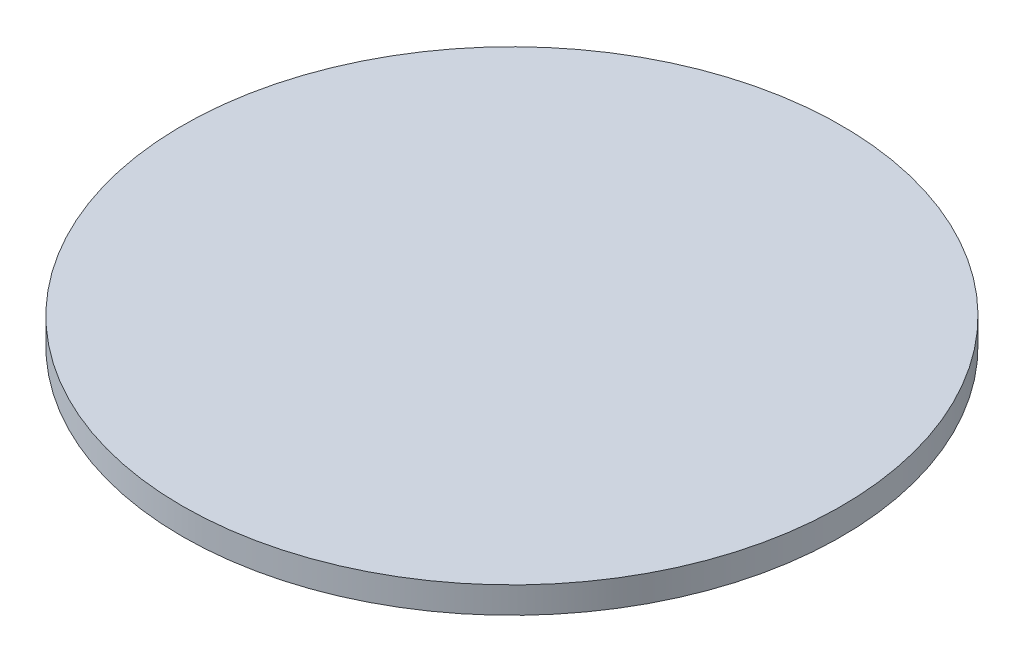
ISO-10303-21;
HEADER;
FILE_DESCRIPTION(('STEP AP214'),'2;1');
FILE_NAME('part.step','',(''),(''),'','','');
FILE_SCHEMA(('AUTOMOTIVE_DESIGN { 1 0 10303 214 1 1 1 1 }'));
ENDSEC;
DATA;
#1=APPLICATION_CONTEXT('core data for automotive mechanical design processes');
#2=APPLICATION_PROTOCOL_DEFINITION('international standard','automotive_design',2000,#1);
#3=PRODUCT_CONTEXT('',#1,'mechanical');
#4=PRODUCT('Part','Part','',(#3));
#5=PRODUCT_RELATED_PRODUCT_CATEGORY('part','',(#4));
#6=PRODUCT_DEFINITION_FORMATION('','',#4);
#7=PRODUCT_DEFINITION_CONTEXT('part definition',#1,'design');
#8=PRODUCT_DEFINITION('design','',#6,#7);
#9=PRODUCT_DEFINITION_SHAPE('','',#8);
#10=(LENGTH_UNIT() NAMED_UNIT(*) SI_UNIT(.MILLI.,.METRE.));
#11=(NAMED_UNIT(*) PLANE_ANGLE_UNIT() SI_UNIT($,.RADIAN.));
#12=(NAMED_UNIT(*) SI_UNIT($,.STERADIAN.) SOLID_ANGLE_UNIT());
#13=UNCERTAINTY_MEASURE_WITH_UNIT(LENGTH_MEASURE(1.E-05),#10,'distance_accuracy_value','');
#14=(GEOMETRIC_REPRESENTATION_CONTEXT(3) GLOBAL_UNCERTAINTY_ASSIGNED_CONTEXT((#13)) GLOBAL_UNIT_ASSIGNED_CONTEXT((#10,
#11,#12)) REPRESENTATION_CONTEXT('',''));
#15=CARTESIAN_POINT('',(0.,0.,0.));
#16=DIRECTION('',(0.,0.,1.));
#17=DIRECTION('',(1.,0.,0.));
#18=AXIS2_PLACEMENT_3D('',#15,#16,#17);
#19=CARTESIAN_POINT('',(0.,70.,0.));
#20=DIRECTION('',(0.,-1.,0.));
#21=DIRECTION('',(0.,0.,-1.));
#22=AXIS2_PLACEMENT_3D('',#19,#20,#21);
#23=CYLINDRICAL_SURFACE('',#22,25.);
#24=CARTESIAN_POINT('',(0.,45.,0.));
#25=DIRECTION('',(0.,1.,0.));
#26=DIRECTION('',(0.,0.,1.));
#27=AXIS2_PLACEMENT_3D('',#24,#25,#26);
#28=CIRCLE('',#27,25.);
#29=CARTESIAN_POINT('',(0.,45.,25.));
#30=VERTEX_POINT('',#29);
#31=EDGE_CURVE('E42',#30,#30,#28,.T.);
#32=ORIENTED_EDGE('',*,*,#31,.T.);
#33=EDGE_LOOP('',(#32));
#34=FACE_BOUND('',#33,.T.);
#35=CARTESIAN_POINT('',(0.,70.,0.));
#36=DIRECTION('',(0.,1.,0.));
#37=DIRECTION('',(0.,0.,1.));
#38=AXIS2_PLACEMENT_3D('',#35,#36,#37);
#39=CIRCLE('',#38,25.);
#40=CARTESIAN_POINT('',(0.,70.,25.));
#41=VERTEX_POINT('',#40);
#42=EDGE_CURVE('E49',#41,#41,#39,.T.);
#43=ORIENTED_EDGE('',*,*,#42,.F.);
#44=EDGE_LOOP('',(#43));
#45=FACE_BOUND('',#44,.T.);
#46=ADVANCED_FACE('F39',(#34,#45),#23,.T.);
#47=CARTESIAN_POINT('',(-74.5562616578539,45.,1.56287456729842));
#48=DIRECTION('',(0.,-1.,0.));
#49=DIRECTION('',(0.,0.,-1.));
#50=AXIS2_PLACEMENT_3D('',#47,#48,#49);
#51=CYLINDRICAL_SURFACE('',#50,25.);
#52=CARTESIAN_POINT('',(-74.5562616578539,40.,1.56287456729842));
#53=DIRECTION('',(0.,1.,0.));
#54=DIRECTION('',(0.,0.,1.));
#55=AXIS2_PLACEMENT_3D('',#52,#53,#54);
#56=CIRCLE('',#55,25.);
#57=CARTESIAN_POINT('',(-49.9259355921232,40.,-2.72046967473791));
#58=VERTEX_POINT('',#57);
#59=CARTESIAN_POINT('',(-49.7680731491791,40.,4.81029053363275));
#60=VERTEX_POINT('',#59);
#61=EDGE_CURVE('E76',#58,#60,#56,.T.);
#62=ORIENTED_EDGE('',*,*,#61,.T.);
#63=DIRECTION('',(0.,-1.,0.));
#64=VECTOR('',#63,1.);
#65=CARTESIAN_POINT('',(-49.7680731491791,45.,4.81029053363275));
#66=LINE('',#65,#64);
#67=CARTESIAN_POINT('',(-49.7680731491791,45.,4.81029053363275));
#68=VERTEX_POINT('',#67);
#69=EDGE_CURVE('E72',#68,#60,#66,.T.);
#70=ORIENTED_EDGE('',*,*,#69,.F.);
#71=CARTESIAN_POINT('',(-74.5562616578539,45.,1.56287456729842));
#72=DIRECTION('',(0.,1.,0.));
#73=DIRECTION('',(0.,0.,1.));
#74=AXIS2_PLACEMENT_3D('',#71,#72,#73);
#75=CIRCLE('',#74,25.);
#76=CARTESIAN_POINT('',(-49.9259355921232,45.,-2.72046967473791));
#77=VERTEX_POINT('',#76);
#78=EDGE_CURVE('E75',#77,#68,#75,.T.);
#79=ORIENTED_EDGE('',*,*,#78,.F.);
#80=DIRECTION('',(0.,-1.,0.));
#81=VECTOR('',#80,1.);
#82=CARTESIAN_POINT('',(-49.9259355921232,45.,-2.72046967473791));
#83=LINE('',#82,#81);
#84=EDGE_CURVE('E69',#77,#58,#83,.T.);
#85=ORIENTED_EDGE('',*,*,#84,.T.);
#86=EDGE_LOOP('',(#62,#70,#79,#85));
#87=FACE_BOUND('',#86,.T.);
#88=ADVANCED_FACE('F79',(#87),#51,.T.);
#89=CARTESIAN_POINT('',(0.,45.,0.));
#90=DIRECTION('',(0.,-1.,0.));
#91=DIRECTION('',(0.,0.,-1.));
#92=AXIS2_PLACEMENT_3D('',#89,#90,#91);
#93=CYLINDRICAL_SURFACE('',#92,50.);
#94=CARTESIAN_POINT('',(0.,40.,0.));
#95=DIRECTION('',(0.,1.,0.));
#96=DIRECTION('',(0.,0.,1.));
#97=AXIS2_PLACEMENT_3D('',#94,#95,#96);
#98=CIRCLE('',#97,50.);
#99=EDGE_CURVE('E64',#60,#58,#98,.T.);
#100=ORIENTED_EDGE('',*,*,#99,.T.);
#101=ORIENTED_EDGE('',*,*,#84,.F.);
#102=CARTESIAN_POINT('',(0.,45.,0.));
#103=DIRECTION('',(0.,1.,0.));
#104=DIRECTION('',(0.,0.,1.));
#105=AXIS2_PLACEMENT_3D('',#102,#103,#104);
#106=CIRCLE('',#105,50.);
#107=EDGE_CURVE('E56',#68,#77,#106,.T.);
#108=ORIENTED_EDGE('',*,*,#107,.F.);
#109=ORIENTED_EDGE('',*,*,#69,.T.);
#110=EDGE_LOOP('',(#100,#101,#108,#109));
#111=FACE_BOUND('',#110,.T.);
#112=ADVANCED_FACE('F68',(#111),#93,.T.);
#113=CARTESIAN_POINT('',(-37.2781308289269,45.,0.781437283649211));
#114=DIRECTION('',(0.,1.,0.));
#115=DIRECTION('',(0.,0.,1.));
#116=AXIS2_PLACEMENT_3D('',#113,#114,#115);
#117=PLANE('',#116);
#118=ORIENTED_EDGE('',*,*,#31,.F.);
#119=EDGE_LOOP('',(#118));
#120=FACE_BOUND('',#119,.T.);
#121=ORIENTED_EDGE('',*,*,#78,.T.);
#122=ORIENTED_EDGE('',*,*,#107,.T.);
#123=EDGE_LOOP('',(#121,#122));
#124=FACE_BOUND('',#123,.T.);
#125=ADVANCED_FACE('F109',(#120,#124),#117,.T.);
#126=CARTESIAN_POINT('',(-37.2781308289269,40.,0.781437283649211));
#127=DIRECTION('',(0.,1.,0.));
#128=DIRECTION('',(0.,0.,1.));
#129=AXIS2_PLACEMENT_3D('',#126,#127,#128);
#130=PLANE('',#129);
#131=CARTESIAN_POINT('',(0.,40.,0.));
#132=DIRECTION('',(0.,1.,0.));
#133=DIRECTION('',(0.,0.,1.));
#134=AXIS2_PLACEMENT_3D('',#131,#132,#133);
#135=CIRCLE('',#134,25.);
#136=CARTESIAN_POINT('',(0.,40.,25.));
#137=VERTEX_POINT('',#136);
#138=EDGE_CURVE('E11',#137,#137,#135,.T.);
#139=ORIENTED_EDGE('',*,*,#138,.T.);
#140=EDGE_LOOP('',(#139));
#141=FACE_BOUND('',#140,.T.);
#142=ORIENTED_EDGE('',*,*,#61,.F.);
#143=ORIENTED_EDGE('',*,*,#99,.F.);
#144=EDGE_LOOP('',(#142,#143));
#145=FACE_BOUND('',#144,.T.);
#146=ADVANCED_FACE('F82',(#141,#145),#130,.F.);
#147=CARTESIAN_POINT('',(0.,0.,0.));
#148=DIRECTION('',(0.,1.,0.));
#149=DIRECTION('',(0.,0.,1.));
#150=AXIS2_PLACEMENT_3D('',#147,#148,#149);
#151=PLANE('',#150);
#152=CARTESIAN_POINT('',(0.,0.,0.));
#153=DIRECTION('',(0.,1.,0.));
#154=DIRECTION('',(0.,0.,1.));
#155=AXIS2_PLACEMENT_3D('',#152,#153,#154);
#156=CIRCLE('',#155,25.);
#157=CARTESIAN_POINT('',(0.,0.,25.));
#158=VERTEX_POINT('',#157);
#159=EDGE_CURVE('E98',#158,#158,#156,.T.);
#160=ORIENTED_EDGE('',*,*,#159,.F.);
#161=EDGE_LOOP('',(#160));
#162=FACE_BOUND('',#161,.T.);
#163=ADVANCED_FACE('F139',(#162),#151,.F.);
#164=ORIENTED_EDGE('',*,*,#159,.T.);
#165=EDGE_LOOP('',(#164));
#166=FACE_BOUND('',#165,.T.);
#167=ORIENTED_EDGE('',*,*,#138,.F.);
#168=EDGE_LOOP('',(#167));
#169=FACE_BOUND('',#168,.T.);
#170=ADVANCED_FACE('F133',(#166,#169),#23,.T.);
#171=CARTESIAN_POINT('',(0.,80.,0.));
#172=DIRECTION('',(0.,-1.,0.));
#173=DIRECTION('',(0.,0.,-1.));
#174=AXIS2_PLACEMENT_3D('',#171,#172,#173);
#175=CYLINDRICAL_SURFACE('',#174,125.);
#176=CARTESIAN_POINT('',(0.,80.,0.));
#177=DIRECTION('',(0.,1.,0.));
#178=DIRECTION('',(0.,0.,1.));
#179=AXIS2_PLACEMENT_3D('',#176,#177,#178);
#180=CIRCLE('',#179,125.);
#181=CARTESIAN_POINT('',(0.,80.,125.));
#182=VERTEX_POINT('',#181);
#183=EDGE_CURVE('E84',#182,#182,#180,.T.);
#184=ORIENTED_EDGE('',*,*,#183,.F.);
#185=EDGE_LOOP('',(#184));
#186=FACE_BOUND('',#185,.T.);
#187=CARTESIAN_POINT('',(0.,70.,0.));
#188=DIRECTION('',(0.,1.,0.));
#189=DIRECTION('',(0.,0.,1.));
#190=AXIS2_PLACEMENT_3D('',#187,#188,#189);
#191=CIRCLE('',#190,125.);
#192=CARTESIAN_POINT('',(0.,70.,125.));
#193=VERTEX_POINT('',#192);
#194=EDGE_CURVE('E88',#193,#193,#191,.T.);
#195=ORIENTED_EDGE('',*,*,#194,.T.);
#196=EDGE_LOOP('',(#195));
#197=FACE_BOUND('',#196,.T.);
#198=ADVANCED_FACE('F119',(#186,#197),#175,.T.);
#199=CARTESIAN_POINT('',(0.,80.,0.));
#200=DIRECTION('',(0.,1.,0.));
#201=DIRECTION('',(0.,0.,1.));
#202=AXIS2_PLACEMENT_3D('',#199,#200,#201);
#203=PLANE('',#202);
#204=ORIENTED_EDGE('',*,*,#183,.T.);
#205=EDGE_LOOP('',(#204));
#206=FACE_BOUND('',#205,.T.);
#207=ADVANCED_FACE('F123',(#206),#203,.T.);
#208=CARTESIAN_POINT('',(0.,70.,0.));
#209=DIRECTION('',(0.,1.,0.));
#210=DIRECTION('',(0.,0.,1.));
#211=AXIS2_PLACEMENT_3D('',#208,#209,#210);
#212=PLANE('',#211);
#213=ORIENTED_EDGE('',*,*,#42,.T.);
#214=EDGE_LOOP('',(#213));
#215=FACE_BOUND('',#214,.T.);
#216=ORIENTED_EDGE('',*,*,#194,.F.);
#217=EDGE_LOOP('',(#216));
#218=FACE_BOUND('',#217,.T.);
#219=ADVANCED_FACE('F121',(#215,#218),#212,.F.);
#220=CLOSED_SHELL('',(#46,#88,#112,#125,#146,#163,#170,#198,#207,#219));
#221=MANIFOLD_SOLID_BREP('B2',#220);
#222=ADVANCED_BREP_SHAPE_REPRESENTATION('',(#18,#221),#14);
#223=SHAPE_DEFINITION_REPRESENTATION(#9,#222);
ENDSEC;
END-ISO-10303-21;
